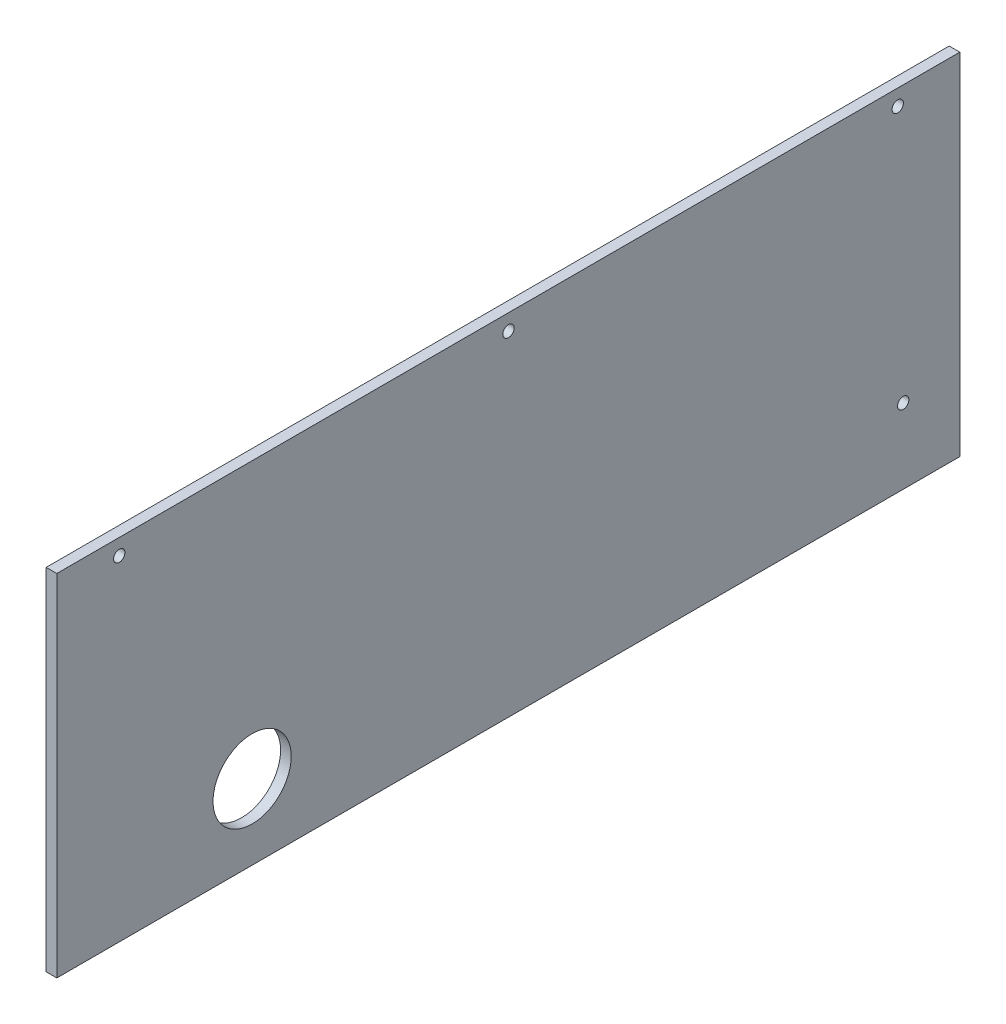
ISO-10303-21;
HEADER;
FILE_DESCRIPTION(('STEP AP214'),'2;1');
FILE_NAME('part.step','',(''),(''),'','','');
FILE_SCHEMA(('AUTOMOTIVE_DESIGN { 1 0 10303 214 1 1 1 1 }'));
ENDSEC;
DATA;
#1=APPLICATION_CONTEXT('core data for automotive mechanical design processes');
#2=APPLICATION_PROTOCOL_DEFINITION('international standard','automotive_design',2000,#1);
#3=PRODUCT_CONTEXT('',#1,'mechanical');
#4=PRODUCT('Part','Part','',(#3));
#5=PRODUCT_RELATED_PRODUCT_CATEGORY('part','',(#4));
#6=PRODUCT_DEFINITION_FORMATION('','',#4);
#7=PRODUCT_DEFINITION_CONTEXT('part definition',#1,'design');
#8=PRODUCT_DEFINITION('design','',#6,#7);
#9=PRODUCT_DEFINITION_SHAPE('','',#8);
#10=(LENGTH_UNIT() NAMED_UNIT(*) SI_UNIT(.MILLI.,.METRE.));
#11=(NAMED_UNIT(*) PLANE_ANGLE_UNIT() SI_UNIT($,.RADIAN.));
#12=(NAMED_UNIT(*) SI_UNIT($,.STERADIAN.) SOLID_ANGLE_UNIT());
#13=UNCERTAINTY_MEASURE_WITH_UNIT(LENGTH_MEASURE(1.E-05),#10,'distance_accuracy_value','');
#14=(GEOMETRIC_REPRESENTATION_CONTEXT(3) GLOBAL_UNCERTAINTY_ASSIGNED_CONTEXT((#13)) GLOBAL_UNIT_ASSIGNED_CONTEXT((#10,
#11,#12)) REPRESENTATION_CONTEXT('',''));
#15=CARTESIAN_POINT('',(0.,0.,0.));
#16=DIRECTION('',(0.,0.,1.));
#17=DIRECTION('',(1.,0.,0.));
#18=AXIS2_PLACEMENT_3D('',#15,#16,#17);
#19=CARTESIAN_POINT('',(163.2,-180.,-19.2));
#20=DIRECTION('',(0.,1.,0.));
#21=DIRECTION('',(0.,0.,1.));
#22=AXIS2_PLACEMENT_3D('',#19,#20,#21);
#23=PLANE('',#22);
#24=DIRECTION('',(0.,0.,1.));
#25=VECTOR('',#24,1.);
#26=CARTESIAN_POINT('',(166.2,-180.,-19.2));
#27=LINE('',#26,#25);
#28=CARTESIAN_POINT('',(166.2,-180.,-19.2));
#29=VERTEX_POINT('',#28);
#30=CARTESIAN_POINT('',(166.2,-180.,236.));
#31=VERTEX_POINT('',#30);
#32=EDGE_CURVE('E112',#29,#31,#27,.T.);
#33=ORIENTED_EDGE('',*,*,#32,.T.);
#34=DIRECTION('',(1.,0.,0.));
#35=VECTOR('',#34,1.);
#36=CARTESIAN_POINT('',(163.2,-180.,236.));
#37=LINE('',#36,#35);
#38=CARTESIAN_POINT('',(163.2,-180.,236.));
#39=VERTEX_POINT('',#38);
#40=EDGE_CURVE('E11',#39,#31,#37,.T.);
#41=ORIENTED_EDGE('',*,*,#40,.F.);
#42=DIRECTION('',(0.,0.,1.));
#43=VECTOR('',#42,1.);
#44=CARTESIAN_POINT('',(163.2,-180.,-19.2));
#45=LINE('',#44,#43);
#46=CARTESIAN_POINT('',(163.2,-180.,-19.2));
#47=VERTEX_POINT('',#46);
#48=EDGE_CURVE('E99',#47,#39,#45,.T.);
#49=ORIENTED_EDGE('',*,*,#48,.F.);
#50=DIRECTION('',(1.,0.,0.));
#51=VECTOR('',#50,1.);
#52=CARTESIAN_POINT('',(163.2,-180.,-19.2));
#53=LINE('',#52,#51);
#54=EDGE_CURVE('E108',#47,#29,#53,.T.);
#55=ORIENTED_EDGE('',*,*,#54,.T.);
#56=EDGE_LOOP('',(#33,#41,#49,#55));
#57=FACE_BOUND('',#56,.T.);
#58=ADVANCED_FACE('F46',(#57),#23,.F.);
#59=CARTESIAN_POINT('',(163.2,-180.,236.));
#60=DIRECTION('',(0.,0.,-1.));
#61=DIRECTION('',(-1.,0.,0.));
#62=AXIS2_PLACEMENT_3D('',#59,#60,#61);
#63=PLANE('',#62);
#64=DIRECTION('',(0.,1.,0.));
#65=VECTOR('',#64,1.);
#66=CARTESIAN_POINT('',(166.2,-180.,236.));
#67=LINE('',#66,#65);
#68=CARTESIAN_POINT('',(166.2,-81.,236.));
#69=VERTEX_POINT('',#68);
#70=EDGE_CURVE('E103',#31,#69,#67,.T.);
#71=ORIENTED_EDGE('',*,*,#70,.T.);
#72=DIRECTION('',(1.,0.,0.));
#73=VECTOR('',#72,1.);
#74=CARTESIAN_POINT('',(163.2,-81.,236.));
#75=LINE('',#74,#73);
#76=CARTESIAN_POINT('',(163.2,-81.,236.));
#77=VERTEX_POINT('',#76);
#78=EDGE_CURVE('E55',#77,#69,#75,.T.);
#79=ORIENTED_EDGE('',*,*,#78,.F.);
#80=DIRECTION('',(0.,1.,0.));
#81=VECTOR('',#80,1.);
#82=CARTESIAN_POINT('',(163.2,-180.,236.));
#83=LINE('',#82,#81);
#84=EDGE_CURVE('E94',#39,#77,#83,.T.);
#85=ORIENTED_EDGE('',*,*,#84,.F.);
#86=ORIENTED_EDGE('',*,*,#40,.T.);
#87=EDGE_LOOP('',(#71,#79,#85,#86));
#88=FACE_BOUND('',#87,.T.);
#89=ADVANCED_FACE('F102',(#88),#63,.F.);
#90=CARTESIAN_POINT('',(163.2,-81.,-19.2));
#91=DIRECTION('',(0.,-1.,0.));
#92=DIRECTION('',(0.,0.,-1.));
#93=AXIS2_PLACEMENT_3D('',#90,#91,#92);
#94=PLANE('',#93);
#95=DIRECTION('',(0.,0.,-1.));
#96=VECTOR('',#95,1.);
#97=CARTESIAN_POINT('',(166.2,-81.,-19.2));
#98=LINE('',#97,#96);
#99=CARTESIAN_POINT('',(166.2,-81.,-19.2));
#100=VERTEX_POINT('',#99);
#101=EDGE_CURVE('E81',#69,#100,#98,.T.);
#102=ORIENTED_EDGE('',*,*,#101,.T.);
#103=DIRECTION('',(1.,0.,0.));
#104=VECTOR('',#103,1.);
#105=CARTESIAN_POINT('',(163.2,-81.,-19.2));
#106=LINE('',#105,#104);
#107=CARTESIAN_POINT('',(163.2,-81.,-19.2));
#108=VERTEX_POINT('',#107);
#109=EDGE_CURVE('E104',#108,#100,#106,.T.);
#110=ORIENTED_EDGE('',*,*,#109,.F.);
#111=DIRECTION('',(0.,0.,-1.));
#112=VECTOR('',#111,1.);
#113=CARTESIAN_POINT('',(163.2,-81.,-19.2));
#114=LINE('',#113,#112);
#115=EDGE_CURVE('E97',#77,#108,#114,.T.);
#116=ORIENTED_EDGE('',*,*,#115,.F.);
#117=ORIENTED_EDGE('',*,*,#78,.T.);
#118=EDGE_LOOP('',(#102,#110,#116,#117));
#119=FACE_BOUND('',#118,.T.);
#120=ADVANCED_FACE('F106',(#119),#94,.F.);
#121=CARTESIAN_POINT('',(163.2,-81.,-19.2));
#122=DIRECTION('',(0.,0.,1.));
#123=DIRECTION('',(0.,-1.,0.));
#124=AXIS2_PLACEMENT_3D('',#121,#122,#123);
#125=PLANE('',#124);
#126=DIRECTION('',(0.,-1.,0.));
#127=VECTOR('',#126,1.);
#128=CARTESIAN_POINT('',(166.2,-81.,-19.2));
#129=LINE('',#128,#127);
#130=EDGE_CURVE('E87',#100,#29,#129,.T.);
#131=ORIENTED_EDGE('',*,*,#130,.T.);
#132=ORIENTED_EDGE('',*,*,#54,.F.);
#133=DIRECTION('',(0.,-1.,0.));
#134=VECTOR('',#133,1.);
#135=CARTESIAN_POINT('',(163.2,-81.,-19.2));
#136=LINE('',#135,#134);
#137=EDGE_CURVE('E64',#108,#47,#136,.T.);
#138=ORIENTED_EDGE('',*,*,#137,.F.);
#139=ORIENTED_EDGE('',*,*,#109,.T.);
#140=EDGE_LOOP('',(#131,#132,#138,#139));
#141=FACE_BOUND('',#140,.T.);
#142=ADVANCED_FACE('F168',(#141),#125,.F.);
#143=CARTESIAN_POINT('',(163.2,0.,0.));
#144=DIRECTION('',(-1.,0.,0.));
#145=DIRECTION('',(0.,0.,1.));
#146=AXIS2_PLACEMENT_3D('',#143,#144,#145);
#147=PLANE('',#146);
#148=CARTESIAN_POINT('',(163.2,-158.85,-3.19999999999998));
#149=DIRECTION('',(-1.,0.,0.));
#150=DIRECTION('',(0.,0.,1.));
#151=AXIS2_PLACEMENT_3D('',#148,#149,#150);
#152=CIRCLE('',#151,1.6);
#153=CARTESIAN_POINT('',(163.2,-158.85,-1.59999999999998));
#154=VERTEX_POINT('',#153);
#155=EDGE_CURVE('E242',#154,#154,#152,.T.);
#156=ORIENTED_EDGE('',*,*,#155,.F.);
#157=EDGE_LOOP('',(#156));
#158=FACE_BOUND('',#157,.T.);
#159=CARTESIAN_POINT('',(163.2,-158.85,180.8));
#160=DIRECTION('',(-1.,0.,0.));
#161=DIRECTION('',(0.,0.,1.));
#162=AXIS2_PLACEMENT_3D('',#159,#160,#161);
#163=CIRCLE('',#162,11.05);
#164=CARTESIAN_POINT('',(163.2,-158.85,191.85));
#165=VERTEX_POINT('',#164);
#166=EDGE_CURVE('E245',#165,#165,#163,.T.);
#167=ORIENTED_EDGE('',*,*,#166,.F.);
#168=EDGE_LOOP('',(#167));
#169=FACE_BOUND('',#168,.T.);
#170=CARTESIAN_POINT('',(163.2,-85.5,-1.65549429597915));
#171=DIRECTION('',(-1.,0.,0.));
#172=DIRECTION('',(0.,0.,1.));
#173=AXIS2_PLACEMENT_3D('',#170,#171,#172);
#174=CIRCLE('',#173,1.6);
#175=CARTESIAN_POINT('',(163.2,-85.5,-0.0554942959791476));
#176=VERTEX_POINT('',#175);
#177=EDGE_CURVE('E123',#176,#176,#174,.T.);
#178=ORIENTED_EDGE('',*,*,#177,.F.);
#179=EDGE_LOOP('',(#178));
#180=FACE_BOUND('',#179,.T.);
#181=CARTESIAN_POINT('',(163.2,-85.5,218.344505704021));
#182=DIRECTION('',(-1.,0.,0.));
#183=DIRECTION('',(0.,0.,-1.));
#184=AXIS2_PLACEMENT_3D('',#181,#182,#183);
#185=CIRCLE('',#184,1.60000000000002);
#186=CARTESIAN_POINT('',(163.2,-85.5,216.744505704021));
#187=VERTEX_POINT('',#186);
#188=EDGE_CURVE('E256',#187,#187,#185,.T.);
#189=ORIENTED_EDGE('',*,*,#188,.F.);
#190=EDGE_LOOP('',(#189));
#191=FACE_BOUND('',#190,.T.);
#192=CARTESIAN_POINT('',(163.2,-85.5,108.344505704021));
#193=DIRECTION('',(-1.,0.,0.));
#194=DIRECTION('',(0.,0.,1.));
#195=AXIS2_PLACEMENT_3D('',#192,#193,#194);
#196=CIRCLE('',#195,1.60000000000001);
#197=CARTESIAN_POINT('',(163.2,-85.5,109.944505704021));
#198=VERTEX_POINT('',#197);
#199=EDGE_CURVE('E254',#198,#198,#196,.T.);
#200=ORIENTED_EDGE('',*,*,#199,.F.);
#201=EDGE_LOOP('',(#200));
#202=FACE_BOUND('',#201,.T.);
#203=ORIENTED_EDGE('',*,*,#48,.T.);
#204=ORIENTED_EDGE('',*,*,#84,.T.);
#205=ORIENTED_EDGE('',*,*,#115,.T.);
#206=ORIENTED_EDGE('',*,*,#137,.T.);
#207=EDGE_LOOP('',(#203,#204,#205,#206));
#208=FACE_BOUND('',#207,.T.);
#209=ADVANCED_FACE('F95',(#158,#169,#180,#191,#202,#208),#147,.T.);
#210=CARTESIAN_POINT('',(166.2,0.,0.));
#211=DIRECTION('',(-1.,0.,0.));
#212=DIRECTION('',(0.,0.,1.));
#213=AXIS2_PLACEMENT_3D('',#210,#211,#212);
#214=PLANE('',#213);
#215=CARTESIAN_POINT('',(166.2,-158.85,-3.19999999999998));
#216=DIRECTION('',(1.,0.,0.));
#217=DIRECTION('',(0.,0.,-1.));
#218=AXIS2_PLACEMENT_3D('',#215,#216,#217);
#219=CIRCLE('',#218,1.6);
#220=CARTESIAN_POINT('',(166.2,-158.85,-4.79999999999998));
#221=VERTEX_POINT('',#220);
#222=EDGE_CURVE('E244',#221,#221,#219,.T.);
#223=ORIENTED_EDGE('',*,*,#222,.F.);
#224=EDGE_LOOP('',(#223));
#225=FACE_BOUND('',#224,.T.);
#226=CARTESIAN_POINT('',(166.2,-158.85,180.8));
#227=DIRECTION('',(1.,0.,0.));
#228=DIRECTION('',(0.,0.,-1.));
#229=AXIS2_PLACEMENT_3D('',#226,#227,#228);
#230=CIRCLE('',#229,11.05);
#231=CARTESIAN_POINT('',(166.2,-158.85,169.75));
#232=VERTEX_POINT('',#231);
#233=EDGE_CURVE('E246',#232,#232,#230,.T.);
#234=ORIENTED_EDGE('',*,*,#233,.F.);
#235=EDGE_LOOP('',(#234));
#236=FACE_BOUND('',#235,.T.);
#237=CARTESIAN_POINT('',(166.2,-85.5,-1.65549429597915));
#238=DIRECTION('',(-1.,0.,0.));
#239=DIRECTION('',(0.,0.,1.));
#240=AXIS2_PLACEMENT_3D('',#237,#238,#239);
#241=CIRCLE('',#240,1.6);
#242=CARTESIAN_POINT('',(166.2,-85.5,-0.0554942959791476));
#243=VERTEX_POINT('',#242);
#244=EDGE_CURVE('E49',#243,#243,#241,.T.);
#245=ORIENTED_EDGE('',*,*,#244,.T.);
#246=EDGE_LOOP('',(#245));
#247=FACE_BOUND('',#246,.T.);
#248=CARTESIAN_POINT('',(166.2,-85.5,218.344505704021));
#249=DIRECTION('',(-1.,0.,0.));
#250=DIRECTION('',(0.,0.,1.));
#251=AXIS2_PLACEMENT_3D('',#248,#249,#250);
#252=CIRCLE('',#251,1.60000000000002);
#253=CARTESIAN_POINT('',(166.2,-85.5,219.944505704021));
#254=VERTEX_POINT('',#253);
#255=EDGE_CURVE('E122',#254,#254,#252,.T.);
#256=ORIENTED_EDGE('',*,*,#255,.T.);
#257=EDGE_LOOP('',(#256));
#258=FACE_BOUND('',#257,.T.);
#259=CARTESIAN_POINT('',(166.2,-85.5,108.344505704021));
#260=DIRECTION('',(-1.,0.,0.));
#261=DIRECTION('',(0.,0.,1.));
#262=AXIS2_PLACEMENT_3D('',#259,#260,#261);
#263=CIRCLE('',#262,1.60000000000001);
#264=CARTESIAN_POINT('',(166.2,-85.5,109.944505704021));
#265=VERTEX_POINT('',#264);
#266=EDGE_CURVE('E120',#265,#265,#263,.T.);
#267=ORIENTED_EDGE('',*,*,#266,.T.);
#268=EDGE_LOOP('',(#267));
#269=FACE_BOUND('',#268,.T.);
#270=ORIENTED_EDGE('',*,*,#32,.F.);
#271=ORIENTED_EDGE('',*,*,#130,.F.);
#272=ORIENTED_EDGE('',*,*,#101,.F.);
#273=ORIENTED_EDGE('',*,*,#70,.F.);
#274=EDGE_LOOP('',(#270,#271,#272,#273));
#275=FACE_BOUND('',#274,.T.);
#276=ADVANCED_FACE('F130',(#225,#236,#247,#258,#269,#275),#214,.F.);
#277=CARTESIAN_POINT('',(175.725483399594,-85.5,108.344505704021));
#278=DIRECTION('',(-1.,0.,0.));
#279=DIRECTION('',(0.,0.,1.));
#280=AXIS2_PLACEMENT_3D('',#277,#278,#279);
#281=CYLINDRICAL_SURFACE('',#280,1.60000000000001);
#282=ORIENTED_EDGE('',*,*,#199,.T.);
#283=EDGE_LOOP('',(#282));
#284=FACE_BOUND('',#283,.T.);
#285=ORIENTED_EDGE('',*,*,#266,.F.);
#286=EDGE_LOOP('',(#285));
#287=FACE_BOUND('',#286,.T.);
#288=ADVANCED_FACE('F146',(#284,#287),#281,.F.);
#289=CARTESIAN_POINT('',(175.725483399594,-85.5,218.344505704021));
#290=DIRECTION('',(-1.,0.,0.));
#291=DIRECTION('',(0.,0.,1.));
#292=AXIS2_PLACEMENT_3D('',#289,#290,#291);
#293=CYLINDRICAL_SURFACE('',#292,1.60000000000002);
#294=ORIENTED_EDGE('',*,*,#188,.T.);
#295=EDGE_LOOP('',(#294));
#296=FACE_BOUND('',#295,.T.);
#297=ORIENTED_EDGE('',*,*,#255,.F.);
#298=EDGE_LOOP('',(#297));
#299=FACE_BOUND('',#298,.T.);
#300=ADVANCED_FACE('F135',(#296,#299),#293,.F.);
#301=CARTESIAN_POINT('',(175.725483399594,-85.5,-1.65549429597915));
#302=DIRECTION('',(-1.,0.,0.));
#303=DIRECTION('',(0.,0.,1.));
#304=AXIS2_PLACEMENT_3D('',#301,#302,#303);
#305=CYLINDRICAL_SURFACE('',#304,1.6);
#306=ORIENTED_EDGE('',*,*,#177,.T.);
#307=EDGE_LOOP('',(#306));
#308=FACE_BOUND('',#307,.T.);
#309=ORIENTED_EDGE('',*,*,#244,.F.);
#310=EDGE_LOOP('',(#309));
#311=FACE_BOUND('',#310,.T.);
#312=ADVANCED_FACE('F132',(#308,#311),#305,.F.);
#313=CARTESIAN_POINT('',(63.2,-158.85,180.8));
#314=DIRECTION('',(1.,0.,0.));
#315=DIRECTION('',(0.,0.,-1.));
#316=AXIS2_PLACEMENT_3D('',#313,#314,#315);
#317=CYLINDRICAL_SURFACE('',#316,11.05);
#318=ORIENTED_EDGE('',*,*,#166,.T.);
#319=EDGE_LOOP('',(#318));
#320=FACE_BOUND('',#319,.T.);
#321=ORIENTED_EDGE('',*,*,#233,.T.);
#322=EDGE_LOOP('',(#321));
#323=FACE_BOUND('',#322,.T.);
#324=ADVANCED_FACE('F134',(#320,#323),#317,.F.);
#325=CARTESIAN_POINT('',(63.2,-158.85,-3.19999999999998));
#326=DIRECTION('',(1.,0.,0.));
#327=DIRECTION('',(0.,0.,-1.));
#328=AXIS2_PLACEMENT_3D('',#325,#326,#327);
#329=CYLINDRICAL_SURFACE('',#328,1.6);
#330=ORIENTED_EDGE('',*,*,#155,.T.);
#331=EDGE_LOOP('',(#330));
#332=FACE_BOUND('',#331,.T.);
#333=ORIENTED_EDGE('',*,*,#222,.T.);
#334=EDGE_LOOP('',(#333));
#335=FACE_BOUND('',#334,.T.);
#336=ADVANCED_FACE('F143',(#332,#335),#329,.F.);
#337=CLOSED_SHELL('',(#58,#89,#120,#142,#209,#276,#288,#300,#312,#324,#336));
#338=MANIFOLD_SOLID_BREP('B2',#337);
#339=ADVANCED_BREP_SHAPE_REPRESENTATION('',(#18,#338),#14);
#340=SHAPE_DEFINITION_REPRESENTATION(#9,#339);
ENDSEC;
END-ISO-10303-21;
